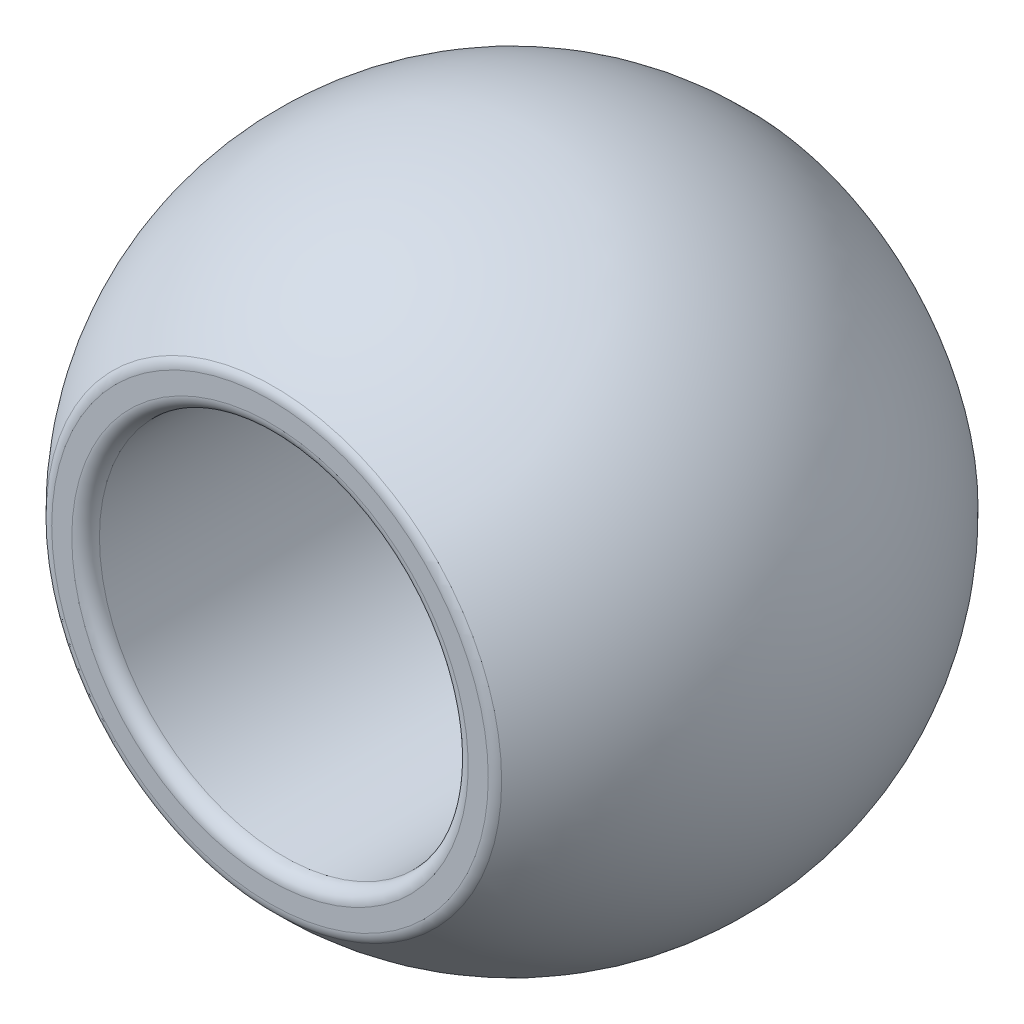
ISO-10303-21;
HEADER;
FILE_DESCRIPTION(('STEP AP214'),'2;1');
FILE_NAME('part.step','',(''),(''),'','','');
FILE_SCHEMA(('AUTOMOTIVE_DESIGN { 1 0 10303 214 1 1 1 1 }'));
ENDSEC;
DATA;
#1=APPLICATION_CONTEXT('core data for automotive mechanical design processes');
#2=APPLICATION_PROTOCOL_DEFINITION('international standard','automotive_design',2000,#1);
#3=PRODUCT_CONTEXT('',#1,'mechanical');
#4=PRODUCT('Part','Part','',(#3));
#5=PRODUCT_RELATED_PRODUCT_CATEGORY('part','',(#4));
#6=PRODUCT_DEFINITION_FORMATION('','',#4);
#7=PRODUCT_DEFINITION_CONTEXT('part definition',#1,'design');
#8=PRODUCT_DEFINITION('design','',#6,#7);
#9=PRODUCT_DEFINITION_SHAPE('','',#8);
#10=(LENGTH_UNIT() NAMED_UNIT(*) SI_UNIT(.MILLI.,.METRE.));
#11=(NAMED_UNIT(*) PLANE_ANGLE_UNIT() SI_UNIT($,.RADIAN.));
#12=(NAMED_UNIT(*) SI_UNIT($,.STERADIAN.) SOLID_ANGLE_UNIT());
#13=UNCERTAINTY_MEASURE_WITH_UNIT(LENGTH_MEASURE(1.E-05),#10,'distance_accuracy_value','');
#14=(GEOMETRIC_REPRESENTATION_CONTEXT(3) GLOBAL_UNCERTAINTY_ASSIGNED_CONTEXT((#13)) GLOBAL_UNIT_ASSIGNED_CONTEXT((#10,
#11,#12)) REPRESENTATION_CONTEXT('',''));
#15=CARTESIAN_POINT('',(0.,0.,0.));
#16=DIRECTION('',(0.,0.,1.));
#17=DIRECTION('',(1.,0.,0.));
#18=AXIS2_PLACEMENT_3D('',#15,#16,#17);
#19=CARTESIAN_POINT('',(0.,0.,0.));
#20=DIRECTION('',(0.,-1.,0.));
#21=DIRECTION('',(-1.,0.,0.));
#22=AXIS2_PLACEMENT_3D('',#19,#20,#21);
#23=SPHERICAL_SURFACE('',#22,7.15);
#24=CARTESIAN_POINT('',(0.,0.,0.));
#25=DIRECTION('',(0.,0.,1.));
#26=DIRECTION('',(1.,0.,0.));
#27=AXIS2_PLACEMENT_3D('',#24,#25,#26);
#28=SPHERICAL_SURFACE('',#27,7.15);
#29=CARTESIAN_POINT('',(0.,0.,-5.16678832116788));
#30=DIRECTION('',(0.,0.,1.));
#31=DIRECTION('',(1.,0.,0.));
#32=AXIS2_PLACEMENT_3D('',#29,#30,#31);
#33=CIRCLE('',#32,4.94234746292115);
#34=CARTESIAN_POINT('',(4.94234746292115,0.,-5.16678832116788));
#35=VERTEX_POINT('',#34);
#36=EDGE_CURVE('E10',#35,#35,#33,.T.);
#37=ORIENTED_EDGE('',*,*,#36,.T.);
#38=EDGE_LOOP('',(#37));
#39=FACE_BOUND('',#38,.T.);
#40=CARTESIAN_POINT('',(0.,0.,5.16678832116788));
#41=DIRECTION('',(0.,0.,-1.));
#42=DIRECTION('',(-1.,0.,0.));
#43=AXIS2_PLACEMENT_3D('',#40,#41,#42);
#44=CIRCLE('',#43,4.94234746292116);
#45=CARTESIAN_POINT('',(-4.94234746292116,0.,5.16678832116788));
#46=VERTEX_POINT('',#45);
#47=EDGE_CURVE('E39',#46,#46,#44,.T.);
#48=ORIENTED_EDGE('',*,*,#47,.T.);
#49=EDGE_LOOP('',(#48));
#50=FACE_BOUND('',#49,.T.);
#51=ADVANCED_FACE('F32',(#39,#50),#28,.T.);
#52=CARTESIAN_POINT('',(-7.15,7.5,5.25));
#53=DIRECTION('',(0.,0.,-1.));
#54=DIRECTION('',(-1.,0.,0.));
#55=AXIS2_PLACEMENT_3D('',#52,#53,#54);
#56=PLANE('',#55);
#57=CARTESIAN_POINT('',(0.,0.,5.25));
#58=DIRECTION('',(0.,0.,-1.));
#59=DIRECTION('',(-1.,0.,0.));
#60=AXIS2_PLACEMENT_3D('',#57,#58,#59);
#61=CIRCLE('',#60,4.3);
#62=CARTESIAN_POINT('',(-4.3,0.,5.25));
#63=VERTEX_POINT('',#62);
#64=EDGE_CURVE('E43',#63,#63,#61,.T.);
#65=ORIENTED_EDGE('',*,*,#64,.T.);
#66=EDGE_LOOP('',(#65));
#67=FACE_BOUND('',#66,.T.);
#68=CARTESIAN_POINT('',(0.,0.,5.25));
#69=DIRECTION('',(0.,0.,-1.));
#70=DIRECTION('',(-1.,0.,0.));
#71=AXIS2_PLACEMENT_3D('',#68,#69,#70);
#72=CIRCLE('',#71,4.73497624070069);
#73=CARTESIAN_POINT('',(-4.73497624070069,0.,5.25));
#74=VERTEX_POINT('',#73);
#75=EDGE_CURVE('E47',#74,#74,#72,.F.);
#76=ORIENTED_EDGE('',*,*,#75,.T.);
#77=EDGE_LOOP('',(#76));
#78=FACE_BOUND('',#77,.T.);
#79=ADVANCED_FACE('F80',(#67,#78),#56,.F.);
#80=CARTESIAN_POINT('',(-7.15,7.5,-5.25));
#81=DIRECTION('',(0.,0.,1.));
#82=DIRECTION('',(1.,0.,0.));
#83=AXIS2_PLACEMENT_3D('',#80,#81,#82);
#84=PLANE('',#83);
#85=CARTESIAN_POINT('',(0.,0.,-5.25));
#86=DIRECTION('',(0.,0.,1.));
#87=DIRECTION('',(1.,0.,0.));
#88=AXIS2_PLACEMENT_3D('',#85,#86,#87);
#89=CIRCLE('',#88,4.3);
#90=CARTESIAN_POINT('',(4.3,0.,-5.25));
#91=VERTEX_POINT('',#90);
#92=EDGE_CURVE('E58',#91,#91,#89,.T.);
#93=ORIENTED_EDGE('',*,*,#92,.T.);
#94=EDGE_LOOP('',(#93));
#95=FACE_BOUND('',#94,.T.);
#96=CARTESIAN_POINT('',(0.,0.,-5.25));
#97=DIRECTION('',(0.,0.,1.));
#98=DIRECTION('',(1.,0.,0.));
#99=AXIS2_PLACEMENT_3D('',#96,#97,#98);
#100=CIRCLE('',#99,4.73497624070068);
#101=CARTESIAN_POINT('',(4.73497624070068,0.,-5.25));
#102=VERTEX_POINT('',#101);
#103=EDGE_CURVE('E61',#102,#102,#100,.F.);
#104=ORIENTED_EDGE('',*,*,#103,.T.);
#105=EDGE_LOOP('',(#104));
#106=FACE_BOUND('',#105,.T.);
#107=ADVANCED_FACE('F65',(#95,#106),#84,.F.);
#108=CARTESIAN_POINT('',(0.,0.,-5.25));
#109=DIRECTION('',(0.,0.,1.));
#110=DIRECTION('',(1.,0.,0.));
#111=AXIS2_PLACEMENT_3D('',#108,#109,#110);
#112=CYLINDRICAL_SURFACE('',#111,4.);
#113=CARTESIAN_POINT('',(0.,0.,-4.95));
#114=DIRECTION('',(0.,0.,1.));
#115=DIRECTION('',(1.,0.,0.));
#116=AXIS2_PLACEMENT_3D('',#113,#114,#115);
#117=CIRCLE('',#116,4.);
#118=CARTESIAN_POINT('',(4.,0.,-4.95));
#119=VERTEX_POINT('',#118);
#120=EDGE_CURVE('E52',#119,#119,#117,.F.);
#121=CARTESIAN_POINT('',(0.,0.,4.95));
#122=DIRECTION('',(0.,0.,-1.));
#123=DIRECTION('',(-1.,0.,0.));
#124=AXIS2_PLACEMENT_3D('',#121,#122,#123);
#125=CIRCLE('',#124,4.);
#126=CARTESIAN_POINT('',(4.,0.,4.95));
#127=VERTEX_POINT('',#126);
#128=EDGE_CURVE('E55',#127,#127,#125,.F.);
#129=CARTESIAN_POINT('',(4.,0.,-4.95));
#130=CARTESIAN_POINT('',(4.,0.,-4.846875));
#131=CARTESIAN_POINT('',(4.,0.,-4.74375));
#132=CARTESIAN_POINT('',(4.,0.,-4.5375));
#133=CARTESIAN_POINT('',(4.,0.,-4.434375));
#134=CARTESIAN_POINT('',(4.,0.,-4.228125));
#135=CARTESIAN_POINT('',(4.,0.,-4.125));
#136=CARTESIAN_POINT('',(4.,0.,-3.91875));
#137=CARTESIAN_POINT('',(4.,0.,-3.815625));
#138=CARTESIAN_POINT('',(4.,0.,-3.609375));
#139=CARTESIAN_POINT('',(4.,0.,-3.50625));
#140=CARTESIAN_POINT('',(4.,0.,-3.3));
#141=CARTESIAN_POINT('',(4.,0.,-3.196875));
#142=CARTESIAN_POINT('',(4.,0.,-2.990625));
#143=CARTESIAN_POINT('',(4.,0.,-2.8875));
#144=CARTESIAN_POINT('',(4.,0.,-2.68125));
#145=CARTESIAN_POINT('',(4.,0.,-2.578125));
#146=CARTESIAN_POINT('',(4.,0.,-2.371875));
#147=CARTESIAN_POINT('',(4.,0.,-2.26875));
#148=CARTESIAN_POINT('',(4.,0.,-2.0625));
#149=CARTESIAN_POINT('',(4.,0.,-1.959375));
#150=CARTESIAN_POINT('',(4.,0.,-1.753125));
#151=CARTESIAN_POINT('',(4.,0.,-1.65));
#152=CARTESIAN_POINT('',(4.,0.,-1.44375));
#153=CARTESIAN_POINT('',(4.,0.,-1.340625));
#154=CARTESIAN_POINT('',(4.,0.,-1.134375));
#155=CARTESIAN_POINT('',(4.,0.,-1.03125));
#156=CARTESIAN_POINT('',(4.,0.,-0.825000000000001));
#157=CARTESIAN_POINT('',(4.,0.,-0.721875000000001));
#158=CARTESIAN_POINT('',(4.,0.,-0.515625));
#159=CARTESIAN_POINT('',(4.,0.,-0.4125));
#160=CARTESIAN_POINT('',(4.,0.,-0.20625));
#161=CARTESIAN_POINT('',(4.,0.,-0.103125));
#162=CARTESIAN_POINT('',(4.,0.,0.103124999999999));
#163=CARTESIAN_POINT('',(4.,0.,0.20625));
#164=CARTESIAN_POINT('',(4.,0.,0.4125));
#165=CARTESIAN_POINT('',(4.,0.,0.515625));
#166=CARTESIAN_POINT('',(4.,0.,0.721875));
#167=CARTESIAN_POINT('',(4.,0.,0.825));
#168=CARTESIAN_POINT('',(4.,0.,1.03125));
#169=CARTESIAN_POINT('',(4.,0.,1.134375));
#170=CARTESIAN_POINT('',(4.,0.,1.340625));
#171=CARTESIAN_POINT('',(4.,0.,1.44375));
#172=CARTESIAN_POINT('',(4.,0.,1.65));
#173=CARTESIAN_POINT('',(4.,0.,1.753125));
#174=CARTESIAN_POINT('',(4.,0.,1.959375));
#175=CARTESIAN_POINT('',(4.,0.,2.0625));
#176=CARTESIAN_POINT('',(4.,0.,2.26875));
#177=CARTESIAN_POINT('',(4.,0.,2.371875));
#178=CARTESIAN_POINT('',(4.,0.,2.578125));
#179=CARTESIAN_POINT('',(4.,0.,2.68125));
#180=CARTESIAN_POINT('',(4.,0.,2.8875));
#181=CARTESIAN_POINT('',(4.,0.,2.990625));
#182=CARTESIAN_POINT('',(4.,0.,3.196875));
#183=CARTESIAN_POINT('',(4.,0.,3.3));
#184=CARTESIAN_POINT('',(4.,0.,3.50625));
#185=CARTESIAN_POINT('',(4.,0.,3.609375));
#186=CARTESIAN_POINT('',(4.,0.,3.815625));
#187=CARTESIAN_POINT('',(4.,0.,3.91875));
#188=CARTESIAN_POINT('',(4.,0.,4.125));
#189=CARTESIAN_POINT('',(4.,0.,4.228125));
#190=CARTESIAN_POINT('',(4.,0.,4.434375));
#191=CARTESIAN_POINT('',(4.,0.,4.5375));
#192=CARTESIAN_POINT('',(4.,0.,4.74375));
#193=CARTESIAN_POINT('',(4.,0.,4.846875));
#194=CARTESIAN_POINT('',(4.,0.,4.95));
#195=B_SPLINE_CURVE_WITH_KNOTS('',3,(#129,#130,#131,#132,#133,#134,#135,#136,#137,#138,#139,
#140,#141,#142,#143,#144,#145,#146,#147,#148,#149,#150,#151,#152,#153,#154,#155,#156,#157,#158,
#159,#160,#161,#162,#163,#164,#165,#166,#167,#168,#169,#170,#171,#172,#173,#174,#175,#176,#177,
#178,#179,#180,#181,#182,#183,#184,#185,#186,#187,#188,#189,#190,#191,#192,#193,#194),
.UNSPECIFIED.,.F.,.F.,(4,2,2,2,2,2,2,2,2,2,2,2,2,2,2,2,2,2,2,2,2,2,2,2,2,2,2,2,2,2,2,2,4),(0.,
0.309375000000001,0.61875,0.928125000000001,1.2375,1.546875,1.85625,2.165625,2.475,2.784375,
3.09375,3.403125,3.7125,4.021875,4.33125,4.640625,4.95,5.259375,5.56875,5.878125,6.1875,
6.496875,6.80625,7.115625,7.425,7.734375,8.04375,8.353125,8.6625,8.971875,9.28125,9.590625,9.9),.UNSPECIFIED.);
#196=EDGE_CURVE('BSEAM90',#119,#127,#195,.T.);
#197=ORIENTED_EDGE('',*,*,#120,.T.);
#198=ORIENTED_EDGE('',*,*,#128,.T.);
#199=ORIENTED_EDGE('',*,*,#196,.T.);
#200=ORIENTED_EDGE('',*,*,#196,.F.);
#201=EDGE_LOOP('',(#197,#199,#198,#200));
#202=FACE_BOUND('',#201,.T.);
#203=ADVANCED_FACE('F90',(#202),#112,.F.);
#204=CARTESIAN_POINT('',(0.,0.,-4.95));
#205=DIRECTION('',(0.,0.,1.));
#206=DIRECTION('',(1.,0.,0.));
#207=AXIS2_PLACEMENT_3D('',#204,#205,#206);
#208=TOROIDAL_SURFACE('',#207,4.3,0.3);
#209=ORIENTED_EDGE('',*,*,#120,.F.);
#210=EDGE_LOOP('',(#209));
#211=FACE_BOUND('',#210,.T.);
#212=ORIENTED_EDGE('',*,*,#92,.F.);
#213=EDGE_LOOP('',(#212));
#214=FACE_BOUND('',#213,.T.);
#215=ADVANCED_FACE('F76',(#211,#214),#208,.T.);
#216=CARTESIAN_POINT('',(0.,0.,4.95));
#217=DIRECTION('',(0.,0.,-1.));
#218=DIRECTION('',(-1.,0.,0.));
#219=AXIS2_PLACEMENT_3D('',#216,#217,#218);
#220=TOROIDAL_SURFACE('',#219,4.3,0.3);
#221=ORIENTED_EDGE('',*,*,#64,.F.);
#222=EDGE_LOOP('',(#221));
#223=FACE_BOUND('',#222,.T.);
#224=ORIENTED_EDGE('',*,*,#128,.F.);
#225=EDGE_LOOP('',(#224));
#226=FACE_BOUND('',#225,.T.);
#227=ADVANCED_FACE('F69',(#223,#226),#220,.T.);
#228=CARTESIAN_POINT('',(0.,0.,-4.95));
#229=DIRECTION('',(0.,0.,1.));
#230=DIRECTION('',(1.,0.,0.));
#231=AXIS2_PLACEMENT_3D('',#228,#229,#230);
#232=TOROIDAL_SURFACE('',#231,4.73497624070068,0.3);
#233=ORIENTED_EDGE('',*,*,#36,.F.);
#234=EDGE_LOOP('',(#233));
#235=FACE_BOUND('',#234,.T.);
#236=ORIENTED_EDGE('',*,*,#103,.F.);
#237=EDGE_LOOP('',(#236));
#238=FACE_BOUND('',#237,.T.);
#239=ADVANCED_FACE('F67',(#235,#238),#232,.T.);
#240=CARTESIAN_POINT('',(0.,0.,4.95));
#241=DIRECTION('',(0.,0.,-1.));
#242=DIRECTION('',(-1.,0.,0.));
#243=AXIS2_PLACEMENT_3D('',#240,#241,#242);
#244=TOROIDAL_SURFACE('',#243,4.73497624070069,0.3);
#245=ORIENTED_EDGE('',*,*,#47,.F.);
#246=EDGE_LOOP('',(#245));
#247=FACE_BOUND('',#246,.T.);
#248=ORIENTED_EDGE('',*,*,#75,.F.);
#249=EDGE_LOOP('',(#248));
#250=FACE_BOUND('',#249,.T.);
#251=ADVANCED_FACE('F34',(#247,#250),#244,.T.);
#252=CLOSED_SHELL('',(#51,#79,#107,#203,#215,#227,#239,#251));
#253=MANIFOLD_SOLID_BREP('B2',#252);
#254=ADVANCED_BREP_SHAPE_REPRESENTATION('',(#18,#253),#14);
#255=SHAPE_DEFINITION_REPRESENTATION(#9,#254);
ENDSEC;
END-ISO-10303-21;
